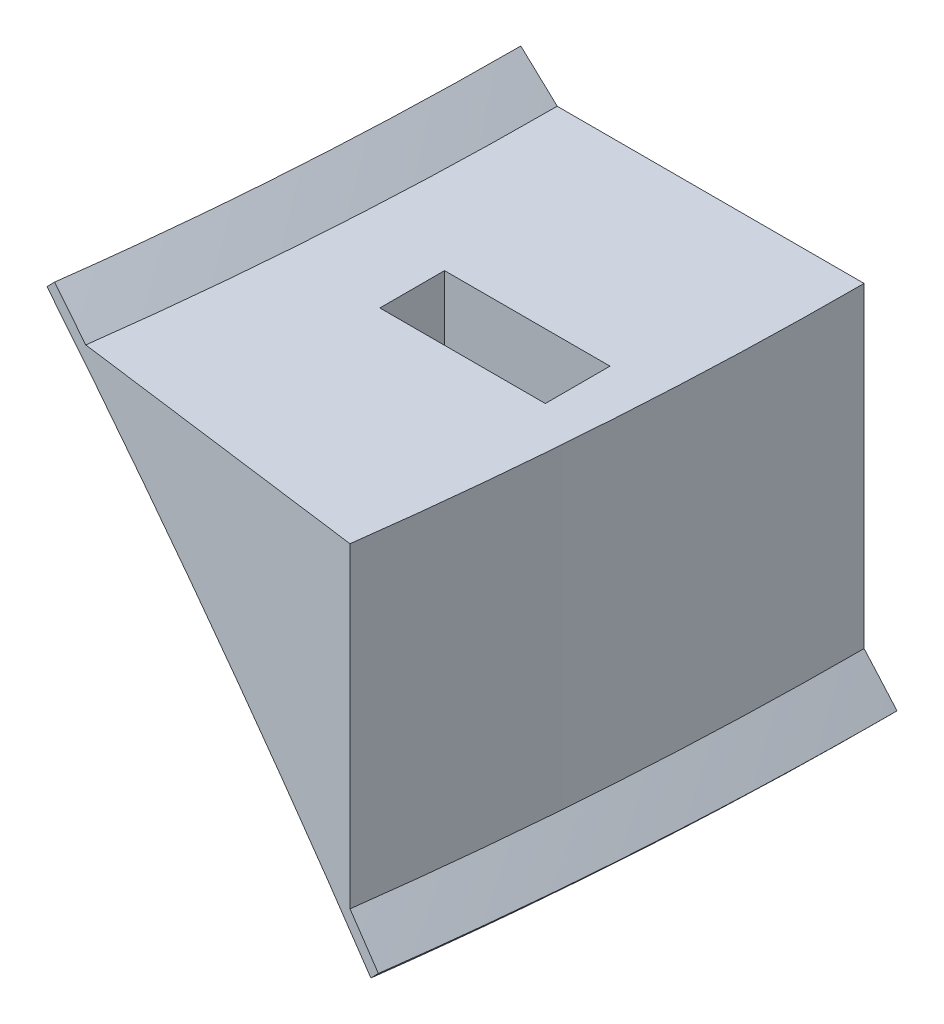
ISO-10303-21;
HEADER;
FILE_DESCRIPTION(('STEP AP214'),'2;1');
FILE_NAME('part.step','',(''),(''),'','','');
FILE_SCHEMA(('AUTOMOTIVE_DESIGN { 1 0 10303 214 1 1 1 1 }'));
ENDSEC;
DATA;
#1=APPLICATION_CONTEXT('core data for automotive mechanical design processes');
#2=APPLICATION_PROTOCOL_DEFINITION('international standard','automotive_design',2000,#1);
#3=PRODUCT_CONTEXT('',#1,'mechanical');
#4=PRODUCT('Part','Part','',(#3));
#5=PRODUCT_RELATED_PRODUCT_CATEGORY('part','',(#4));
#6=PRODUCT_DEFINITION_FORMATION('','',#4);
#7=PRODUCT_DEFINITION_CONTEXT('part definition',#1,'design');
#8=PRODUCT_DEFINITION('design','',#6,#7);
#9=PRODUCT_DEFINITION_SHAPE('','',#8);
#10=(LENGTH_UNIT() NAMED_UNIT(*) SI_UNIT(.MILLI.,.METRE.));
#11=(NAMED_UNIT(*) PLANE_ANGLE_UNIT() SI_UNIT($,.RADIAN.));
#12=(NAMED_UNIT(*) SI_UNIT($,.STERADIAN.) SOLID_ANGLE_UNIT());
#13=UNCERTAINTY_MEASURE_WITH_UNIT(LENGTH_MEASURE(1.E-05),#10,'distance_accuracy_value','');
#14=(GEOMETRIC_REPRESENTATION_CONTEXT(3) GLOBAL_UNCERTAINTY_ASSIGNED_CONTEXT((#13)) GLOBAL_UNIT_ASSIGNED_CONTEXT((#10,
#11,#12)) REPRESENTATION_CONTEXT('',''));
#15=CARTESIAN_POINT('',(0.,0.,0.));
#16=DIRECTION('',(0.,0.,1.));
#17=DIRECTION('',(1.,0.,0.));
#18=AXIS2_PLACEMENT_3D('',#15,#16,#17);
#19=CARTESIAN_POINT('',(0.,0.,0.));
#20=DIRECTION('',(0.,1.,0.));
#21=DIRECTION('',(0.99144486137381,0.,0.130526192220052));
#22=AXIS2_PLACEMENT_3D('',#19,#20,#21);
#23=SPHERICAL_SURFACE('',#22,990.6);
#24=CARTESIAN_POINT('',(741.233680782856,649.875454572319,97.5852653709617));
#25=CARTESIAN_POINT('',(741.766999061893,649.876324894049,93.5285358832754));
#26=CARTESIAN_POINT('',(742.26705468772,649.877141430937,89.4674408770603));
#27=CARTESIAN_POINT('',(743.200517184226,649.878661790976,81.3376670906438));
#28=CARTESIAN_POINT('',(743.633925169652,649.879365616012,77.2689884384385));
#29=CARTESIAN_POINT('',(744.433986812985,649.880655437794,69.1250585643063));
#30=CARTESIAN_POINT('',(744.800640466527,649.881241434532,65.0498073419496));
#31=CARTESIAN_POINT('',(745.467093213299,649.88230283035,56.8938310851268));
#32=CARTESIAN_POINT('',(745.766891197739,649.882778227595,52.8131059610062));
#33=CARTESIAN_POINT('',(746.562178330752,649.884050529898,40.6205792356459));
#34=CARTESIAN_POINT('',(746.959094423213,649.884702165576,32.5020319087194));
#35=CARTESIAN_POINT('',(747.356088633624,649.885336117461,20.3176549092922));
#36=CARTESIAN_POINT('',(747.455356719506,649.88549018294,16.2547492520193));
#37=CARTESIAN_POINT('',(747.58771911583,649.885692122908,8.12792993079874));
#38=CARTESIAN_POINT('',(747.620814562192,649.885739999222,4.06401628535197));
#39=CARTESIAN_POINT('',(747.620817186697,649.885738964239,0.));
#40=B_SPLINE_CURVE_WITH_KNOTS('',3,(#24,#25,#26,#27,#28,#29,#30,#31,#32,#33,#34,#35,#36,#37,#38,
#39),.UNSPECIFIED.,.F.,.F.,(4,2,2,2,2,2,2,4),(0.,12.2747553255937,24.5493053215582,
36.8238561202184,49.098610475062,73.4782010055436,85.6701192359631,97.8618281778953),.UNSPECIFIED.);
#41=CARTESIAN_POINT('',(741.233680782856,649.875454572319,97.5852653709617));
#42=VERTEX_POINT('',#41);
#43=CARTESIAN_POINT('',(747.620817186697,649.885738964239,0.));
#44=VERTEX_POINT('',#43);
#45=EDGE_CURVE('E55',#42,#44,#40,.T.);
#46=ORIENTED_EDGE('',*,*,#45,.F.);
#47=CARTESIAN_POINT('',(0.,0.,0.));
#48=DIRECTION('',(0.130526192220052,0.,-0.99144486137381));
#49=DIRECTION('',(-0.99144486137381,0.,-0.130526192220052));
#50=AXIS2_PLACEMENT_3D('',#47,#48,#49);
#51=CIRCLE('',#50,990.6);
#52=CARTESIAN_POINT('',(666.284367831945,727.776788212432,87.7180011285149));
#53=VERTEX_POINT('',#52);
#54=EDGE_CURVE('E126',#53,#42,#51,.T.);
#55=ORIENTED_EDGE('',*,*,#54,.F.);
#56=CARTESIAN_POINT('',(666.284367831945,727.776788212433,87.7180011285149));
#57=CARTESIAN_POINT('',(666.763694241097,727.777462334678,84.0715818595734));
#58=CARTESIAN_POINT('',(667.213123517525,727.778097601781,80.4212370612257));
#59=CARTESIAN_POINT('',(668.052079372559,727.779284017221,73.1137321326653));
#60=CARTESIAN_POINT('',(668.441606954024,727.779835166966,69.4565721175892));
#61=CARTESIAN_POINT('',(669.160667061949,727.780846962231,62.1363501346331));
#62=CARTESIAN_POINT('',(669.49019958555,727.781307607748,58.4732881664719));
#63=CARTESIAN_POINT('',(670.089181038115,727.782143999332,51.142227859523));
#64=CARTESIAN_POINT('',(670.358628970067,727.782519743992,47.4742294398383));
#65=CARTESIAN_POINT('',(671.073432473608,727.783525547847,36.5144796640047));
#66=CARTESIAN_POINT('',(671.430174411423,727.784040923567,29.2167608986395));
#67=CARTESIAN_POINT('',(671.905968286763,727.784725494797,14.6126122974791));
#68=CARTESIAN_POINT('',(672.024988757902,727.784894644477,7.30618143655124));
#69=CARTESIAN_POINT('',(672.024955895108,727.784871135817,1.13818385694539E-13));
#70=B_SPLINE_CURVE_WITH_KNOTS('',3,(#56,#57,#58,#59,#60,#61,#62,#63,#64,#65,#66,#67,#68,#69),
.UNSPECIFIED.,.F.,.F.,(4,2,2,2,2,2,4),(0.,11.0332329440847,22.0662811522895,33.0993298860549,
44.1325616827255,66.0477368158597,87.9658125943871),.UNSPECIFIED.);
#71=CARTESIAN_POINT('',(672.024955895108,727.784871135817,1.29040810651428E-13));
#72=VERTEX_POINT('',#71);
#73=EDGE_CURVE('E114',#53,#72,#70,.T.);
#74=ORIENTED_EDGE('',*,*,#73,.T.);
#75=CARTESIAN_POINT('',(0.,0.,0.));
#76=DIRECTION('',(0.,0.,-1.));
#77=DIRECTION('',(-1.,0.,0.));
#78=AXIS2_PLACEMENT_3D('',#75,#76,#77);
#79=CIRCLE('',#78,990.6);
#80=EDGE_CURVE('E124',#72,#44,#79,.T.);
#81=ORIENTED_EDGE('',*,*,#80,.T.);
#82=EDGE_LOOP('',(#46,#55,#74,#81));
#83=FACE_BOUND('',#82,.T.);
#84=ADVANCED_FACE('F32',(#83),#23,.F.);
#85=CARTESIAN_POINT('',(0.,0.,0.));
#86=DIRECTION('',(0.,1.,0.));
#87=DIRECTION('',(0.99144486137381,0.,0.130526192220052));
#88=AXIS2_PLACEMENT_3D('',#85,#86,#87);
#89=SPHERICAL_SURFACE('',#88,993.075249624413);
#90=CARTESIAN_POINT('',(749.37168659307,651.64447879902,0.));
#91=CARTESIAN_POINT('',(749.371687933976,651.644480386555,4.09163431463465));
#92=CARTESIAN_POINT('',(749.338179989855,651.644473658352,8.18326126023324));
#93=CARTESIAN_POINT('',(749.204174264122,651.644436714438,16.3653491413621));
#94=CARTESIAN_POINT('',(749.103677610103,651.644406499122,20.4558100953596));
#95=CARTESIAN_POINT('',(748.835723188108,651.644315725463,28.634552755832));
#96=CARTESIAN_POINT('',(748.668265416534,651.644255167119,32.7228344621898));
#97=CARTESIAN_POINT('',(748.266434267879,651.644109028969,40.8961189277456));
#98=CARTESIAN_POINT('',(748.032059774852,651.644023448746,44.9811216311214));
#99=CARTESIAN_POINT('',(747.229811878555,651.643746108618,57.2114128474874));
#100=CARTESIAN_POINT('',(746.562207368431,651.643533457218,65.3504814582206));
#101=CARTESIAN_POINT('',(745.361655351693,651.643112395287,77.539565103441));
#102=CARTESIAN_POINT('',(744.928233588355,651.642955008838,81.5996960226808));
#103=CARTESIAN_POINT('',(743.995117626222,651.642613209498,89.7122637121294));
#104=CARTESIAN_POINT('',(743.49542457925,651.642428797076,93.7647006148222));
#105=CARTESIAN_POINT('',(742.962642955342,651.64223437154,97.8128875592036));
#106=B_SPLINE_CURVE_WITH_KNOTS('',3,(#90,#91,#92,#93,#94,#95,#96,#97,#98,#99,#100,#101,#102,
#103,#104,#105),.UNSPECIFIED.,.F.,.F.,(4,2,2,2,2,2,2,4),(0.,12.2747511444614,24.5492956786139,
36.8238408723823,49.0985907762096,73.5925951002611,85.8417521963291,98.0906964247776),.UNSPECIFIED.);
#107=CARTESIAN_POINT('',(749.37168659307,651.644478799021,1.03378697215386E-13));
#108=VERTEX_POINT('',#107);
#109=CARTESIAN_POINT('',(742.962642955342,651.64223437154,97.8128875592036));
#110=VERTEX_POINT('',#109);
#111=EDGE_CURVE('E181',#108,#110,#106,.T.);
#112=ORIENTED_EDGE('',*,*,#111,.F.);
#113=CARTESIAN_POINT('',(0.,0.,0.));
#114=DIRECTION('',(0.,0.,1.));
#115=DIRECTION('',(1.,0.,0.));
#116=AXIS2_PLACEMENT_3D('',#113,#114,#115);
#117=CIRCLE('',#116,993.075249624413);
#118=CARTESIAN_POINT('',(742.757038561933,659.174053709106,0.));
#119=VERTEX_POINT('',#118);
#120=EDGE_CURVE('E131',#108,#119,#117,.T.);
#121=ORIENTED_EDGE('',*,*,#120,.T.);
#122=CARTESIAN_POINT('',(0.,659.174053709106,0.));
#123=DIRECTION('',(0.,1.,0.));
#124=DIRECTION('',(-1.,0.,0.));
#125=AXIS2_PLACEMENT_3D('',#122,#123,#124);
#126=CIRCLE('',#125,742.757038561933);
#127=CARTESIAN_POINT('',(736.402649131458,659.174053709106,96.9492479881314));
#128=VERTEX_POINT('',#127);
#129=EDGE_CURVE('E161',#128,#119,#126,.T.);
#130=ORIENTED_EDGE('',*,*,#129,.F.);
#131=CARTESIAN_POINT('',(0.,0.,0.));
#132=DIRECTION('',(-0.130526192220052,0.,0.99144486137381));
#133=DIRECTION('',(0.99144486137381,0.,0.130526192220052));
#134=AXIS2_PLACEMENT_3D('',#131,#132,#133);
#135=CIRCLE('',#134,993.075249624413);
#136=EDGE_CURVE('E150',#110,#128,#135,.T.);
#137=ORIENTED_EDGE('',*,*,#136,.F.);
#138=EDGE_LOOP('',(#112,#121,#130,#137));
#139=FACE_BOUND('',#138,.T.);
#140=ADVANCED_FACE('F180',(#139),#89,.T.);
#141=CARTESIAN_POINT('',(0.,0.,0.));
#142=DIRECTION('',(0.130526192220052,0.,-0.99144486137381));
#143=DIRECTION('',(-0.99144486137381,0.,-0.130526192220052));
#144=AXIS2_PLACEMENT_3D('',#141,#142,#143);
#145=PLANE('',#144);
#146=CARTESIAN_POINT('',(743.458910221314,652.149369659047,97.8782223842397));
#147=CARTESIAN_POINT('',(740.894944087651,649.529238749926,97.5406698390135));
#148=CARTESIAN_POINT('',(738.330861521838,646.909223772706,97.2031019652039));
#149=CARTESIAN_POINT('',(733.202463525911,641.669425682065,96.527935560418));
#150=CARTESIAN_POINT('',(730.638148095798,639.049642568646,96.1903370294416));
#151=CARTESIAN_POINT('',(728.073716233535,636.429975387126,95.8527231698819));
#152=B_SPLINE_CURVE_WITH_KNOTS('',3,(#146,#147,#148,#149,#150,#151),.UNSPECIFIED.,.F.,.F.,(4,2,
4),(0.,11.0442994160491,22.0885988320981),.UNSPECIFIED.);
#153=EDGE_CURVE('E127',#110,#42,#152,.T.);
#154=ORIENTED_EDGE('',*,*,#153,.F.);
#155=ORIENTED_EDGE('',*,*,#136,.T.);
#156=DIRECTION('',(0.,1.,0.));
#157=VECTOR('',#156,1.);
#158=CARTESIAN_POINT('',(736.402649131458,659.174053709106,96.9492479881314));
#159=LINE('',#158,#157);
#160=CARTESIAN_POINT('',(736.402649131458,722.715073962553,96.9492479881314));
#161=VERTEX_POINT('',#160);
#162=EDGE_CURVE('E152',#128,#161,#159,.T.);
#163=ORIENTED_EDGE('',*,*,#162,.T.);
#164=DIRECTION('',(-0.99144486137381,0.,-0.130526192220052));
#165=VECTOR('',#164,1.);
#166=CARTESIAN_POINT('',(736.402649131458,722.715073962553,96.9492479881314));
#167=LINE('',#166,#165);
#168=CARTESIAN_POINT('',(675.261568606285,722.715073962553,88.8998720318002));
#169=VERTEX_POINT('',#168);
#170=EDGE_CURVE('E155',#161,#169,#167,.T.);
#171=ORIENTED_EDGE('',*,*,#170,.T.);
#172=CARTESIAN_POINT('',(0.,0.,0.));
#173=DIRECTION('',(-0.130526192220052,0.,0.99144486137381));
#174=DIRECTION('',(0.99144486137381,0.,0.130526192220052));
#175=AXIS2_PLACEMENT_3D('',#172,#173,#174);
#176=CIRCLE('',#175,993.075249624412);
#177=CARTESIAN_POINT('',(668.009253450896,729.539409804935,87.9450866283023));
#178=VERTEX_POINT('',#177);
#179=EDGE_CURVE('E158',#169,#178,#176,.T.);
#180=ORIENTED_EDGE('',*,*,#179,.T.);
#181=CARTESIAN_POINT('',(668.205307516435,729.739758012619,87.9708976356927));
#182=CARTESIAN_POINT('',(660.57557751195,721.942896880537,86.9664246246847));
#183=CARTESIAN_POINT('',(652.944701170512,714.147177633119,85.9618006955539));
#184=CARTESIAN_POINT('',(637.680655813731,698.55802290761,83.9522510010464));
#185=CARTESIAN_POINT('',(630.047486798388,690.764587429519,82.9473252356698));
#186=CARTESIAN_POINT('',(622.413171446093,682.972293836093,81.9422485521704));
#187=B_SPLINE_CURVE_WITH_KNOTS('',3,(#181,#182,#183,#184,#185,#186),.UNSPECIFIED.,.F.,.F.,(4,2,
4),(0.,32.8651035911466,65.7302071822934),.UNSPECIFIED.);
#188=EDGE_CURVE('E226',#178,#53,#187,.T.);
#189=ORIENTED_EDGE('',*,*,#188,.T.);
#190=ORIENTED_EDGE('',*,*,#54,.T.);
#191=EDGE_LOOP('',(#154,#155,#163,#171,#180,#189,#190));
#192=FACE_BOUND('',#191,.T.);
#193=ADVANCED_FACE('F239',(#192),#145,.F.);
#194=CARTESIAN_POINT('',(0.,0.,0.));
#195=DIRECTION('',(0.,1.,0.));
#196=DIRECTION('',(0.99144486137381,0.,0.130526192220052));
#197=AXIS2_PLACEMENT_3D('',#194,#195,#196);
#198=SPHERICAL_SURFACE('',#197,993.075249624412);
#199=CARTESIAN_POINT('',(0.,0.,0.));
#200=DIRECTION('',(0.,0.,1.));
#201=DIRECTION('',(1.,0.,0.));
#202=AXIS2_PLACEMENT_3D('',#199,#200,#201);
#203=CIRCLE('',#202,993.075249624412);
#204=CARTESIAN_POINT('',(681.08837406308,722.715073962553,0.));
#205=VERTEX_POINT('',#204);
#206=CARTESIAN_POINT('',(673.7725224145,729.540293236632,0.));
#207=VERTEX_POINT('',#206);
#208=EDGE_CURVE('E147',#205,#207,#203,.T.);
#209=ORIENTED_EDGE('',*,*,#208,.T.);
#210=CARTESIAN_POINT('',(673.7725224145,729.540293236632,0.));
#211=CARTESIAN_POINT('',(673.772523398392,729.54029464032,3.67778691176964));
#212=CARTESIAN_POINT('',(673.742409024468,729.540293743231,7.35556935161602));
#213=CARTESIAN_POINT('',(673.621976528368,729.540281495806,14.7100865493507));
#214=CARTESIAN_POINT('',(673.531659418569,729.540270145646,18.3868213238165));
#215=CARTESIAN_POINT('',(673.290848410514,729.540231140828,25.7383283863835));
#216=CARTESIAN_POINT('',(673.140354509329,729.54020348617,29.4131006743892));
#217=CARTESIAN_POINT('',(672.779227620789,729.540137824256,36.7597163015998));
#218=CARTESIAN_POINT('',(672.568593630879,729.540099816827,40.431559590954));
#219=CARTESIAN_POINT('',(671.847331320001,729.539982741033,51.4290273815946));
#220=CARTESIAN_POINT('',(671.246937218791,729.53990050205,58.7489567578709));
#221=CARTESIAN_POINT('',(669.80716644241,729.539694533104,73.3662659788298));
#222=CARTESIAN_POINT('',(668.967757718042,729.539570797577,80.6636426667112));
#223=CARTESIAN_POINT('',(668.009253450887,729.539409804926,87.9450866283012));
#224=B_SPLINE_CURVE_WITH_KNOTS('',3,(#210,#211,#212,#213,#214,#215,#216,#217,#218,#219,#220,
#221,#222,#223),.UNSPECIFIED.,.F.,.F.,(4,2,2,2,2,2,4),(0.,11.0332286457254,22.0662717600441,
33.0993154113799,44.1325429979774,66.1618954485997,88.1942031820716),.UNSPECIFIED.);
#225=EDGE_CURVE('E48',#207,#178,#224,.T.);
#226=ORIENTED_EDGE('',*,*,#225,.T.);
#227=ORIENTED_EDGE('',*,*,#179,.F.);
#228=CARTESIAN_POINT('',(0.,722.715073962553,0.));
#229=DIRECTION('',(0.,1.,0.));
#230=DIRECTION('',(-1.,0.,0.));
#231=AXIS2_PLACEMENT_3D('',#228,#229,#230);
#232=CIRCLE('',#231,681.08837406308);
#233=EDGE_CURVE('E120',#169,#205,#232,.T.);
#234=ORIENTED_EDGE('',*,*,#233,.T.);
#235=EDGE_LOOP('',(#209,#226,#227,#234));
#236=FACE_BOUND('',#235,.T.);
#237=ADVANCED_FACE('F34',(#236),#198,.T.);
#238=CARTESIAN_POINT('',(736.402649131458,722.715073962553,96.9492479881314));
#239=DIRECTION('',(0.,-1.,0.));
#240=DIRECTION('',(1.,0.,0.));
#241=AXIS2_PLACEMENT_3D('',#238,#239,#240);
#242=PLANE('',#241);
#243=DIRECTION('',(-1.,0.,0.));
#244=VECTOR('',#243,1.);
#245=CARTESIAN_POINT('',(731.624743140834,722.715073962553,39.9227314072932));
#246=LINE('',#245,#244);
#247=CARTESIAN_POINT('',(731.624743140834,722.715073962553,39.9227314072932));
#248=VERTEX_POINT('',#247);
#249=CARTESIAN_POINT('',(698.374743140834,722.715073962553,39.9227314072932));
#250=VERTEX_POINT('',#249);
#251=EDGE_CURVE('E382',#248,#250,#246,.T.);
#252=ORIENTED_EDGE('',*,*,#251,.F.);
#253=DIRECTION('',(0.,0.,-1.));
#254=VECTOR('',#253,1.);
#255=CARTESIAN_POINT('',(731.624743140834,722.715073962553,39.9227314072932));
#256=LINE('',#255,#254);
#257=CARTESIAN_POINT('',(731.624743140834,722.715073962553,52.9227314072932));
#258=VERTEX_POINT('',#257);
#259=EDGE_CURVE('E184',#258,#248,#256,.T.);
#260=ORIENTED_EDGE('',*,*,#259,.F.);
#261=DIRECTION('',(1.,0.,0.));
#262=VECTOR('',#261,1.);
#263=CARTESIAN_POINT('',(731.624743140834,722.715073962553,52.9227314072932));
#264=LINE('',#263,#262);
#265=CARTESIAN_POINT('',(698.374743140834,722.715073962553,52.9227314072932));
#266=VERTEX_POINT('',#265);
#267=EDGE_CURVE('E372',#266,#258,#264,.T.);
#268=ORIENTED_EDGE('',*,*,#267,.F.);
#269=DIRECTION('',(0.,0.,1.));
#270=VECTOR('',#269,1.);
#271=CARTESIAN_POINT('',(698.374743140834,722.715073962553,39.9227314072932));
#272=LINE('',#271,#270);
#273=EDGE_CURVE('E376',#250,#266,#272,.T.);
#274=ORIENTED_EDGE('',*,*,#273,.F.);
#275=EDGE_LOOP('',(#252,#260,#268,#274));
#276=FACE_BOUND('',#275,.T.);
#277=CARTESIAN_POINT('',(0.,722.715073962553,0.));
#278=DIRECTION('',(0.,1.,0.));
#279=DIRECTION('',(-1.,0.,0.));
#280=AXIS2_PLACEMENT_3D('',#277,#278,#279);
#281=CIRCLE('',#280,742.757038561933);
#282=CARTESIAN_POINT('',(742.757038561933,722.715073962553,0.));
#283=VERTEX_POINT('',#282);
#284=EDGE_CURVE('E164',#161,#283,#281,.T.);
#285=ORIENTED_EDGE('',*,*,#284,.T.);
#286=DIRECTION('',(-1.,0.,0.));
#287=VECTOR('',#286,1.);
#288=CARTESIAN_POINT('',(742.757038561933,722.715073962553,0.));
#289=LINE('',#288,#287);
#290=EDGE_CURVE('E144',#283,#205,#289,.T.);
#291=ORIENTED_EDGE('',*,*,#290,.T.);
#292=ORIENTED_EDGE('',*,*,#233,.F.);
#293=ORIENTED_EDGE('',*,*,#170,.F.);
#294=EDGE_LOOP('',(#285,#291,#292,#293));
#295=FACE_BOUND('',#294,.T.);
#296=ADVANCED_FACE('F171',(#276,#295),#242,.F.);
#297=CARTESIAN_POINT('',(0.,993.075249624412,0.));
#298=DIRECTION('',(0.,1.,0.));
#299=DIRECTION('',(-1.,0.,0.));
#300=AXIS2_PLACEMENT_3D('',#297,#298,#299);
#301=CYLINDRICAL_SURFACE('',#300,742.757038561933);
#302=ORIENTED_EDGE('',*,*,#129,.T.);
#303=DIRECTION('',(0.,1.,0.));
#304=VECTOR('',#303,1.);
#305=CARTESIAN_POINT('',(742.757038561933,659.174053709106,0.));
#306=LINE('',#305,#304);
#307=EDGE_CURVE('E134',#119,#283,#306,.T.);
#308=ORIENTED_EDGE('',*,*,#307,.T.);
#309=ORIENTED_EDGE('',*,*,#284,.F.);
#310=ORIENTED_EDGE('',*,*,#162,.F.);
#311=EDGE_LOOP('',(#302,#308,#309,#310));
#312=FACE_BOUND('',#311,.T.);
#313=ADVANCED_FACE('F174',(#312),#301,.T.);
#314=CARTESIAN_POINT('',(0.,0.,0.));
#315=DIRECTION('',(0.,0.,-1.));
#316=DIRECTION('',(-1.,0.,0.));
#317=AXIS2_PLACEMENT_3D('',#314,#315,#316);
#318=PLANE('',#317);
#319=DIRECTION('',(0.705519294084846,0.708690712281472,0.));
#320=VECTOR('',#319,1.);
#321=CARTESIAN_POINT('',(50.5473662289375,-50.3211648208029,0.));
#322=LINE('',#321,#320);
#323=EDGE_CURVE('E11',#44,#108,#322,.T.);
#324=ORIENTED_EDGE('',*,*,#323,.F.);
#325=ORIENTED_EDGE('',*,*,#80,.F.);
#326=DIRECTION('',(0.705519294084846,0.708690712281472,0.));
#327=VECTOR('',#326,1.);
#328=CARTESIAN_POINT('',(602.433610332778,657.880701726579,1.16556153279555E-13));
#329=LINE('',#328,#327);
#330=EDGE_CURVE('E41',#207,#72,#329,.F.);
#331=ORIENTED_EDGE('',*,*,#330,.F.);
#332=ORIENTED_EDGE('',*,*,#208,.F.);
#333=ORIENTED_EDGE('',*,*,#290,.F.);
#334=ORIENTED_EDGE('',*,*,#307,.F.);
#335=ORIENTED_EDGE('',*,*,#120,.F.);
#336=EDGE_LOOP('',(#324,#325,#331,#332,#333,#334,#335));
#337=FACE_BOUND('',#336,.T.);
#338=ADVANCED_FACE('F129',(#337),#318,.T.);
#339=CARTESIAN_POINT('',(731.624743140834,703.715073962553,39.9227314072932));
#340=DIRECTION('',(1.,0.,0.));
#341=DIRECTION('',(0.,1.,0.));
#342=AXIS2_PLACEMENT_3D('',#339,#340,#341);
#343=PLANE('',#342);
#344=ORIENTED_EDGE('',*,*,#259,.T.);
#345=DIRECTION('',(0.,1.,0.));
#346=VECTOR('',#345,1.);
#347=CARTESIAN_POINT('',(731.624743140834,703.715073962553,39.9227314072932));
#348=LINE('',#347,#346);
#349=CARTESIAN_POINT('',(731.624743140834,703.715073962553,39.9227314072932));
#350=VERTEX_POINT('',#349);
#351=EDGE_CURVE('E139',#350,#248,#348,.T.);
#352=ORIENTED_EDGE('',*,*,#351,.F.);
#353=DIRECTION('',(0.,0.,-1.));
#354=VECTOR('',#353,1.);
#355=CARTESIAN_POINT('',(731.624743140834,703.715073962553,39.9227314072932));
#356=LINE('',#355,#354);
#357=CARTESIAN_POINT('',(731.624743140834,703.715073962553,52.9227314072932));
#358=VERTEX_POINT('',#357);
#359=EDGE_CURVE('E366',#358,#350,#356,.T.);
#360=ORIENTED_EDGE('',*,*,#359,.F.);
#361=DIRECTION('',(0.,1.,0.));
#362=VECTOR('',#361,1.);
#363=CARTESIAN_POINT('',(731.624743140834,703.715073962553,52.9227314072932));
#364=LINE('',#363,#362);
#365=EDGE_CURVE('E132',#358,#258,#364,.T.);
#366=ORIENTED_EDGE('',*,*,#365,.T.);
#367=EDGE_LOOP('',(#344,#352,#360,#366));
#368=FACE_BOUND('',#367,.T.);
#369=ADVANCED_FACE('F285',(#368),#343,.F.);
#370=CARTESIAN_POINT('',(731.624743140834,703.715073962553,52.9227314072932));
#371=DIRECTION('',(0.,0.,1.));
#372=DIRECTION('',(1.,0.,0.));
#373=AXIS2_PLACEMENT_3D('',#370,#371,#372);
#374=PLANE('',#373);
#375=ORIENTED_EDGE('',*,*,#267,.T.);
#376=ORIENTED_EDGE('',*,*,#365,.F.);
#377=DIRECTION('',(1.,0.,0.));
#378=VECTOR('',#377,1.);
#379=CARTESIAN_POINT('',(731.624743140834,703.715073962553,52.9227314072932));
#380=LINE('',#379,#378);
#381=CARTESIAN_POINT('',(698.374743140834,703.715073962553,52.9227314072932));
#382=VERTEX_POINT('',#381);
#383=EDGE_CURVE('E371',#382,#358,#380,.T.);
#384=ORIENTED_EDGE('',*,*,#383,.F.);
#385=DIRECTION('',(0.,1.,0.));
#386=VECTOR('',#385,1.);
#387=CARTESIAN_POINT('',(698.374743140834,703.715073962553,52.9227314072932));
#388=LINE('',#387,#386);
#389=EDGE_CURVE('E136',#382,#266,#388,.T.);
#390=ORIENTED_EDGE('',*,*,#389,.T.);
#391=EDGE_LOOP('',(#375,#376,#384,#390));
#392=FACE_BOUND('',#391,.T.);
#393=ADVANCED_FACE('F291',(#392),#374,.F.);
#394=CARTESIAN_POINT('',(698.374743140834,703.715073962553,39.9227314072932));
#395=DIRECTION('',(-1.,0.,0.));
#396=DIRECTION('',(0.,-1.,0.));
#397=AXIS2_PLACEMENT_3D('',#394,#395,#396);
#398=PLANE('',#397);
#399=ORIENTED_EDGE('',*,*,#273,.T.);
#400=ORIENTED_EDGE('',*,*,#389,.F.);
#401=DIRECTION('',(0.,0.,1.));
#402=VECTOR('',#401,1.);
#403=CARTESIAN_POINT('',(698.374743140834,703.715073962553,39.9227314072932));
#404=LINE('',#403,#402);
#405=CARTESIAN_POINT('',(698.374743140834,703.715073962553,39.9227314072932));
#406=VERTEX_POINT('',#405);
#407=EDGE_CURVE('E373',#406,#382,#404,.T.);
#408=ORIENTED_EDGE('',*,*,#407,.F.);
#409=DIRECTION('',(0.,1.,0.));
#410=VECTOR('',#409,1.);
#411=CARTESIAN_POINT('',(698.374743140834,703.715073962553,39.9227314072932));
#412=LINE('',#411,#410);
#413=EDGE_CURVE('E387',#406,#250,#412,.T.);
#414=ORIENTED_EDGE('',*,*,#413,.T.);
#415=EDGE_LOOP('',(#399,#400,#408,#414));
#416=FACE_BOUND('',#415,.T.);
#417=ADVANCED_FACE('F298',(#416),#398,.F.);
#418=CARTESIAN_POINT('',(731.624743140834,703.715073962553,39.9227314072932));
#419=DIRECTION('',(0.,0.,-1.));
#420=DIRECTION('',(-1.,0.,0.));
#421=AXIS2_PLACEMENT_3D('',#418,#419,#420);
#422=PLANE('',#421);
#423=ORIENTED_EDGE('',*,*,#251,.T.);
#424=ORIENTED_EDGE('',*,*,#413,.F.);
#425=DIRECTION('',(-1.,0.,0.));
#426=VECTOR('',#425,1.);
#427=CARTESIAN_POINT('',(731.624743140834,703.715073962553,39.9227314072932));
#428=LINE('',#427,#426);
#429=EDGE_CURVE('E369',#350,#406,#428,.T.);
#430=ORIENTED_EDGE('',*,*,#429,.F.);
#431=ORIENTED_EDGE('',*,*,#351,.T.);
#432=EDGE_LOOP('',(#423,#424,#430,#431));
#433=FACE_BOUND('',#432,.T.);
#434=ADVANCED_FACE('F306',(#433),#422,.F.);
#435=CARTESIAN_POINT('',(0.,703.715073962553,0.));
#436=DIRECTION('',(0.,-1.,0.));
#437=DIRECTION('',(0.,0.,-1.));
#438=AXIS2_PLACEMENT_3D('',#435,#436,#437);
#439=PLANE('',#438);
#440=ORIENTED_EDGE('',*,*,#359,.T.);
#441=ORIENTED_EDGE('',*,*,#429,.T.);
#442=ORIENTED_EDGE('',*,*,#407,.T.);
#443=ORIENTED_EDGE('',*,*,#383,.T.);
#444=EDGE_LOOP('',(#440,#441,#442,#443));
#445=FACE_BOUND('',#444,.T.);
#446=ADVANCED_FACE('F314',(#445),#439,.F.);
#447=CARTESIAN_POINT('',(599.537786876508,660.763566261497,87.9708976356927));
#448=CARTESIAN_POINT('',(600.501617364419,659.804048952093,73.3942359269006));
#449=CARTESIAN_POINT('',(601.225843618009,659.083063638845,58.7537643875353));
#450=CARTESIAN_POINT('',(602.191840233129,658.121389895733,29.408857227796));
#451=CARTESIAN_POINT('',(602.433610332778,657.880701726579,14.7044309517244));
#452=CARTESIAN_POINT('',(602.433610332778,657.880701726579,1.16556153279555E-13));
#453=B_SPLINE_CURVE_WITH_KNOTS('',3,(#447,#448,#449,#450,#451,#452),.UNSPECIFIED.,.F.,.F.,(4,2,
4),(0.,0.5,1.),.UNSPECIFIED.);
#454=DIRECTION('',(0.705519294084846,0.708690712281472,0.));
#455=VECTOR('',#454,1.);
#456=SURFACE_OF_LINEAR_EXTRUSION('',#453,#455);
#457=ORIENTED_EDGE('',*,*,#188,.F.);
#458=ORIENTED_EDGE('',*,*,#225,.F.);
#459=ORIENTED_EDGE('',*,*,#330,.T.);
#460=ORIENTED_EDGE('',*,*,#73,.F.);
#461=EDGE_LOOP('',(#457,#458,#459,#460));
#462=FACE_BOUND('',#461,.T.);
#463=ADVANCED_FACE('F113',(#462),#456,.F.);
#464=CARTESIAN_POINT('',(676.128150343935,584.515947616568,97.8782223842397));
#465=CARTESIAN_POINT('',(677.200711808153,583.448185906158,81.6571484278895));
#466=CARTESIAN_POINT('',(678.00650935722,582.645994332117,65.3671599377556));
#467=CARTESIAN_POINT('',(679.081274120993,581.576039182002,32.7181094982349));
#468=CARTESIAN_POINT('',(679.350240973576,581.30827596643,16.3590571604307));
#469=CARTESIAN_POINT('',(679.350240973576,581.30827596643,0.));
#470=B_SPLINE_CURVE_WITH_KNOTS('',3,(#464,#465,#466,#467,#468,#469),.UNSPECIFIED.,.F.,.F.,(4,2,
4),(0.,0.5,1.),.UNSPECIFIED.);
#471=DIRECTION('',(0.705519294084846,0.708690712281472,0.));
#472=VECTOR('',#471,1.);
#473=SURFACE_OF_LINEAR_EXTRUSION('',#470,#472);
#474=ORIENTED_EDGE('',*,*,#45,.T.);
#475=ORIENTED_EDGE('',*,*,#323,.T.);
#476=ORIENTED_EDGE('',*,*,#111,.T.);
#477=ORIENTED_EDGE('',*,*,#153,.T.);
#478=EDGE_LOOP('',(#474,#475,#476,#477));
#479=FACE_BOUND('',#478,.T.);
#480=ADVANCED_FACE('F206',(#479),#473,.T.);
#481=CLOSED_SHELL('',(#84,#140,#193,#237,#296,#313,#338,#369,#393,#417,#434,#446,#463,#480));
#482=MANIFOLD_SOLID_BREP('B2',#481);
#483=ADVANCED_BREP_SHAPE_REPRESENTATION('',(#18,#482),#14);
#484=SHAPE_DEFINITION_REPRESENTATION(#9,#483);
ENDSEC;
END-ISO-10303-21;
